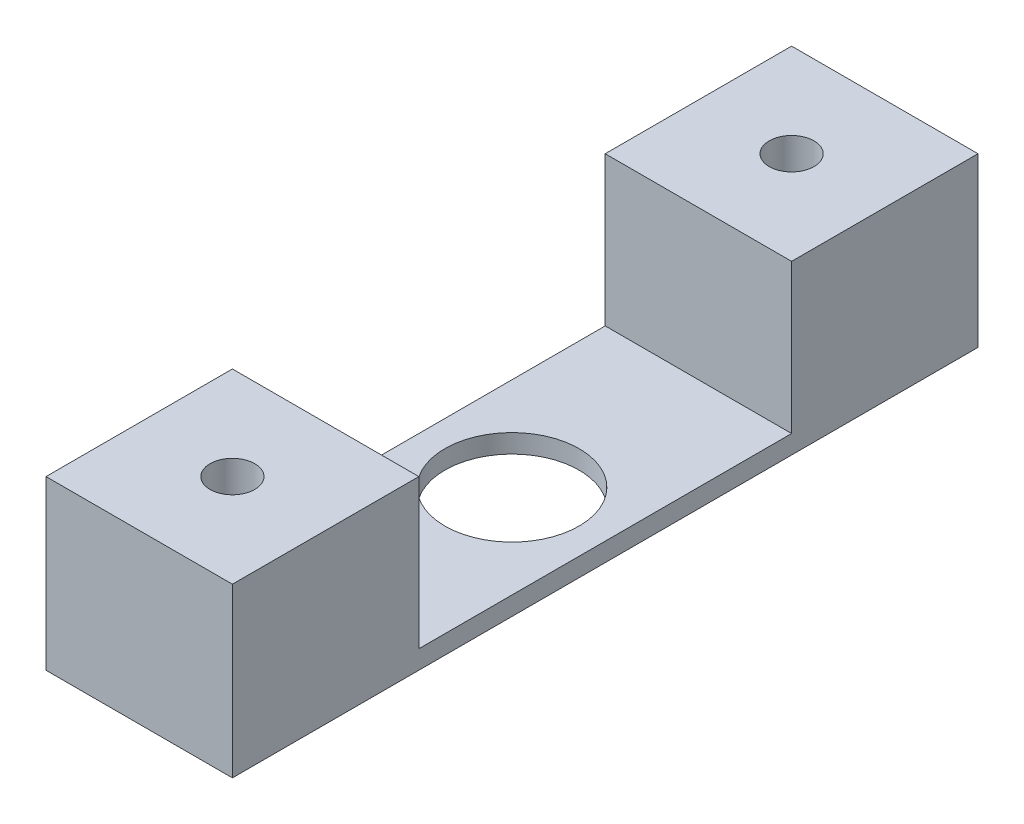
ISO-10303-21;
HEADER;
FILE_DESCRIPTION(('STEP AP214'),'2;1');
FILE_NAME('part.step','',(''),(''),'','','');
FILE_SCHEMA(('AUTOMOTIVE_DESIGN { 1 0 10303 214 1 1 1 1 }'));
ENDSEC;
DATA;
#1=APPLICATION_CONTEXT('core data for automotive mechanical design processes');
#2=APPLICATION_PROTOCOL_DEFINITION('international standard','automotive_design',2000,#1);
#3=PRODUCT_CONTEXT('',#1,'mechanical');
#4=PRODUCT('Part','Part','',(#3));
#5=PRODUCT_RELATED_PRODUCT_CATEGORY('part','',(#4));
#6=PRODUCT_DEFINITION_FORMATION('','',#4);
#7=PRODUCT_DEFINITION_CONTEXT('part definition',#1,'design');
#8=PRODUCT_DEFINITION('design','',#6,#7);
#9=PRODUCT_DEFINITION_SHAPE('','',#8);
#10=(LENGTH_UNIT() NAMED_UNIT(*) SI_UNIT(.MILLI.,.METRE.));
#11=(NAMED_UNIT(*) PLANE_ANGLE_UNIT() SI_UNIT($,.RADIAN.));
#12=(NAMED_UNIT(*) SI_UNIT($,.STERADIAN.) SOLID_ANGLE_UNIT());
#13=UNCERTAINTY_MEASURE_WITH_UNIT(LENGTH_MEASURE(1.E-05),#10,'distance_accuracy_value','');
#14=(GEOMETRIC_REPRESENTATION_CONTEXT(3) GLOBAL_UNCERTAINTY_ASSIGNED_CONTEXT((#13)) GLOBAL_UNIT_ASSIGNED_CONTEXT((#10,
#11,#12)) REPRESENTATION_CONTEXT('',''));
#15=CARTESIAN_POINT('',(0.,0.,0.));
#16=DIRECTION('',(0.,0.,1.));
#17=DIRECTION('',(1.,0.,0.));
#18=AXIS2_PLACEMENT_3D('',#15,#16,#17);
#19=CARTESIAN_POINT('',(0.,9.,0.));
#20=DIRECTION('',(0.,1.,0.));
#21=DIRECTION('',(0.,0.,1.));
#22=AXIS2_PLACEMENT_3D('',#19,#20,#21);
#23=PLANE('',#22);
#24=CARTESIAN_POINT('',(0.,9.,15.));
#25=DIRECTION('',(0.,1.,0.));
#26=DIRECTION('',(0.,0.,1.));
#27=AXIS2_PLACEMENT_3D('',#24,#25,#26);
#28=CIRCLE('',#27,1.19999999999999);
#29=CARTESIAN_POINT('',(0.,9.,16.2));
#30=VERTEX_POINT('',#29);
#31=EDGE_CURVE('E131',#30,#30,#28,.T.);
#32=ORIENTED_EDGE('',*,*,#31,.F.);
#33=EDGE_LOOP('',(#32));
#34=FACE_BOUND('',#33,.T.);
#35=DIRECTION('',(1.,0.,0.));
#36=VECTOR('',#35,1.);
#37=CARTESIAN_POINT('',(-5.,9.,10.));
#38=LINE('',#37,#36);
#39=CARTESIAN_POINT('',(-5.,9.,10.));
#40=VERTEX_POINT('',#39);
#41=CARTESIAN_POINT('',(5.,9.,10.));
#42=VERTEX_POINT('',#41);
#43=EDGE_CURVE('E152',#40,#42,#38,.T.);
#44=ORIENTED_EDGE('',*,*,#43,.F.);
#45=DIRECTION('',(0.,0.,1.));
#46=VECTOR('',#45,1.);
#47=CARTESIAN_POINT('',(-5.,9.,-20.));
#48=LINE('',#47,#46);
#49=CARTESIAN_POINT('',(-5.,9.,20.));
#50=VERTEX_POINT('',#49);
#51=EDGE_CURVE('E187',#40,#50,#48,.T.);
#52=ORIENTED_EDGE('',*,*,#51,.T.);
#53=DIRECTION('',(1.,0.,0.));
#54=VECTOR('',#53,1.);
#55=CARTESIAN_POINT('',(-5.,9.,20.));
#56=LINE('',#55,#54);
#57=CARTESIAN_POINT('',(5.,9.,20.));
#58=VERTEX_POINT('',#57);
#59=EDGE_CURVE('E64',#50,#58,#56,.T.);
#60=ORIENTED_EDGE('',*,*,#59,.T.);
#61=DIRECTION('',(0.,0.,-1.));
#62=VECTOR('',#61,1.);
#63=CARTESIAN_POINT('',(5.,9.,-20.));
#64=LINE('',#63,#62);
#65=EDGE_CURVE('E181',#58,#42,#64,.T.);
#66=ORIENTED_EDGE('',*,*,#65,.T.);
#67=EDGE_LOOP('',(#44,#52,#60,#66));
#68=FACE_BOUND('',#67,.T.);
#69=ADVANCED_FACE('F39',(#34,#68),#23,.T.);
#70=CARTESIAN_POINT('',(5.,9.,-20.));
#71=DIRECTION('',(-1.,0.,0.));
#72=DIRECTION('',(0.,0.,1.));
#73=AXIS2_PLACEMENT_3D('',#70,#71,#72);
#74=PLANE('',#73);
#75=DIRECTION('',(0.,0.,-1.));
#76=VECTOR('',#75,1.);
#77=CARTESIAN_POINT('',(5.,0.999999999999999,-10.));
#78=LINE('',#77,#76);
#79=CARTESIAN_POINT('',(5.,0.999999999999999,10.));
#80=VERTEX_POINT('',#79);
#81=CARTESIAN_POINT('',(5.,0.999999999999999,-10.));
#82=VERTEX_POINT('',#81);
#83=EDGE_CURVE('E147',#80,#82,#78,.T.);
#84=ORIENTED_EDGE('',*,*,#83,.F.);
#85=DIRECTION('',(0.,1.,0.));
#86=VECTOR('',#85,1.);
#87=CARTESIAN_POINT('',(5.,0.999999999999999,10.));
#88=LINE('',#87,#86);
#89=EDGE_CURVE('E167',#80,#42,#88,.T.);
#90=ORIENTED_EDGE('',*,*,#89,.T.);
#91=ORIENTED_EDGE('',*,*,#65,.F.);
#92=DIRECTION('',(0.,-1.,0.));
#93=VECTOR('',#92,1.);
#94=CARTESIAN_POINT('',(5.,9.,20.));
#95=LINE('',#94,#93);
#96=CARTESIAN_POINT('',(5.,0.,20.));
#97=VERTEX_POINT('',#96);
#98=EDGE_CURVE('E194',#58,#97,#95,.T.);
#99=ORIENTED_EDGE('',*,*,#98,.T.);
#100=DIRECTION('',(0.,0.,-1.));
#101=VECTOR('',#100,1.);
#102=CARTESIAN_POINT('',(5.,0.,-20.));
#103=LINE('',#102,#101);
#104=CARTESIAN_POINT('',(5.,0.,-20.));
#105=VERTEX_POINT('',#104);
#106=EDGE_CURVE('E171',#97,#105,#103,.T.);
#107=ORIENTED_EDGE('',*,*,#106,.T.);
#108=DIRECTION('',(0.,-1.,0.));
#109=VECTOR('',#108,1.);
#110=CARTESIAN_POINT('',(5.,9.,-20.));
#111=LINE('',#110,#109);
#112=CARTESIAN_POINT('',(5.,9.,-20.));
#113=VERTEX_POINT('',#112);
#114=EDGE_CURVE('E11',#113,#105,#111,.T.);
#115=ORIENTED_EDGE('',*,*,#114,.F.);
#116=CARTESIAN_POINT('',(5.,9.,-10.));
#117=VERTEX_POINT('',#116);
#118=EDGE_CURVE('E92',#117,#113,#64,.T.);
#119=ORIENTED_EDGE('',*,*,#118,.F.);
#120=DIRECTION('',(0.,1.,0.));
#121=VECTOR('',#120,1.);
#122=CARTESIAN_POINT('',(5.,0.999999999999999,-10.));
#123=LINE('',#122,#121);
#124=EDGE_CURVE('E55',#82,#117,#123,.T.);
#125=ORIENTED_EDGE('',*,*,#124,.F.);
#126=EDGE_LOOP('',(#84,#90,#91,#99,#107,#115,#119,#125));
#127=FACE_BOUND('',#126,.T.);
#128=ADVANCED_FACE('F41',(#127),#74,.F.);
#129=CARTESIAN_POINT('',(-5.,9.,-20.));
#130=DIRECTION('',(0.,0.,1.));
#131=DIRECTION('',(1.,0.,0.));
#132=AXIS2_PLACEMENT_3D('',#129,#130,#131);
#133=PLANE('',#132);
#134=DIRECTION('',(-1.,0.,0.));
#135=VECTOR('',#134,1.);
#136=CARTESIAN_POINT('',(-5.,0.,-20.));
#137=LINE('',#136,#135);
#138=CARTESIAN_POINT('',(-5.,0.,-20.));
#139=VERTEX_POINT('',#138);
#140=EDGE_CURVE('E198',#105,#139,#137,.T.);
#141=ORIENTED_EDGE('',*,*,#140,.T.);
#142=DIRECTION('',(0.,-1.,0.));
#143=VECTOR('',#142,1.);
#144=CARTESIAN_POINT('',(-5.,9.,-20.));
#145=LINE('',#144,#143);
#146=CARTESIAN_POINT('',(-5.,9.,-20.));
#147=VERTEX_POINT('',#146);
#148=EDGE_CURVE('E48',#147,#139,#145,.T.);
#149=ORIENTED_EDGE('',*,*,#148,.F.);
#150=DIRECTION('',(-1.,0.,0.));
#151=VECTOR('',#150,1.);
#152=CARTESIAN_POINT('',(-5.,9.,-20.));
#153=LINE('',#152,#151);
#154=EDGE_CURVE('E184',#113,#147,#153,.T.);
#155=ORIENTED_EDGE('',*,*,#154,.F.);
#156=ORIENTED_EDGE('',*,*,#114,.T.);
#157=EDGE_LOOP('',(#141,#149,#155,#156));
#158=FACE_BOUND('',#157,.T.);
#159=ADVANCED_FACE('F239',(#158),#133,.F.);
#160=CARTESIAN_POINT('',(-5.,9.,-20.));
#161=DIRECTION('',(1.,0.,0.));
#162=DIRECTION('',(0.,0.,-1.));
#163=AXIS2_PLACEMENT_3D('',#160,#161,#162);
#164=PLANE('',#163);
#165=ORIENTED_EDGE('',*,*,#51,.F.);
#166=DIRECTION('',(0.,1.,0.));
#167=VECTOR('',#166,1.);
#168=CARTESIAN_POINT('',(-5.,0.999999999999999,10.));
#169=LINE('',#168,#167);
#170=CARTESIAN_POINT('',(-5.,0.999999999999999,10.));
#171=VERTEX_POINT('',#170);
#172=EDGE_CURVE('E172',#171,#40,#169,.T.);
#173=ORIENTED_EDGE('',*,*,#172,.F.);
#174=DIRECTION('',(0.,0.,1.));
#175=VECTOR('',#174,1.);
#176=CARTESIAN_POINT('',(-5.,0.999999999999999,-10.));
#177=LINE('',#176,#175);
#178=CARTESIAN_POINT('',(-5.,0.999999999999999,-10.));
#179=VERTEX_POINT('',#178);
#180=EDGE_CURVE('E156',#179,#171,#177,.T.);
#181=ORIENTED_EDGE('',*,*,#180,.F.);
#182=DIRECTION('',(0.,1.,0.));
#183=VECTOR('',#182,1.);
#184=CARTESIAN_POINT('',(-5.,0.999999999999999,-10.));
#185=LINE('',#184,#183);
#186=CARTESIAN_POINT('',(-5.,9.,-10.));
#187=VERTEX_POINT('',#186);
#188=EDGE_CURVE('E175',#179,#187,#185,.T.);
#189=ORIENTED_EDGE('',*,*,#188,.T.);
#190=EDGE_CURVE('E188',#147,#187,#48,.T.);
#191=ORIENTED_EDGE('',*,*,#190,.F.);
#192=ORIENTED_EDGE('',*,*,#148,.T.);
#193=DIRECTION('',(0.,0.,1.));
#194=VECTOR('',#193,1.);
#195=CARTESIAN_POINT('',(-5.,0.,-20.));
#196=LINE('',#195,#194);
#197=CARTESIAN_POINT('',(-5.,0.,20.));
#198=VERTEX_POINT('',#197);
#199=EDGE_CURVE('E201',#139,#198,#196,.T.);
#200=ORIENTED_EDGE('',*,*,#199,.T.);
#201=DIRECTION('',(0.,-1.,0.));
#202=VECTOR('',#201,1.);
#203=CARTESIAN_POINT('',(-5.,9.,20.));
#204=LINE('',#203,#202);
#205=EDGE_CURVE('E208',#50,#198,#204,.T.);
#206=ORIENTED_EDGE('',*,*,#205,.F.);
#207=EDGE_LOOP('',(#165,#173,#181,#189,#191,#192,#200,#206));
#208=FACE_BOUND('',#207,.T.);
#209=ADVANCED_FACE('F217',(#208),#164,.F.);
#210=CARTESIAN_POINT('',(-5.,9.,20.));
#211=DIRECTION('',(0.,0.,-1.));
#212=DIRECTION('',(-1.,0.,0.));
#213=AXIS2_PLACEMENT_3D('',#210,#211,#212);
#214=PLANE('',#213);
#215=DIRECTION('',(1.,0.,0.));
#216=VECTOR('',#215,1.);
#217=CARTESIAN_POINT('',(-5.,0.,20.));
#218=LINE('',#217,#216);
#219=EDGE_CURVE('E85',#198,#97,#218,.T.);
#220=ORIENTED_EDGE('',*,*,#219,.T.);
#221=ORIENTED_EDGE('',*,*,#98,.F.);
#222=ORIENTED_EDGE('',*,*,#59,.F.);
#223=ORIENTED_EDGE('',*,*,#205,.T.);
#224=EDGE_LOOP('',(#220,#221,#222,#223));
#225=FACE_BOUND('',#224,.T.);
#226=ADVANCED_FACE('F227',(#225),#214,.F.);
#227=CARTESIAN_POINT('',(0.,9.,-15.));
#228=DIRECTION('',(0.,1.,0.));
#229=DIRECTION('',(0.,0.,1.));
#230=AXIS2_PLACEMENT_3D('',#227,#228,#229);
#231=CIRCLE('',#230,1.19999999999999);
#232=CARTESIAN_POINT('',(0.,9.,-13.8));
#233=VERTEX_POINT('',#232);
#234=EDGE_CURVE('E130',#233,#233,#231,.T.);
#235=ORIENTED_EDGE('',*,*,#234,.F.);
#236=EDGE_LOOP('',(#235));
#237=FACE_BOUND('',#236,.T.);
#238=DIRECTION('',(-1.,0.,0.));
#239=VECTOR('',#238,1.);
#240=CARTESIAN_POINT('',(-5.,9.,-10.));
#241=LINE('',#240,#239);
#242=EDGE_CURVE('E146',#117,#187,#241,.T.);
#243=ORIENTED_EDGE('',*,*,#242,.F.);
#244=ORIENTED_EDGE('',*,*,#118,.T.);
#245=ORIENTED_EDGE('',*,*,#154,.T.);
#246=ORIENTED_EDGE('',*,*,#190,.T.);
#247=EDGE_LOOP('',(#243,#244,#245,#246));
#248=FACE_BOUND('',#247,.T.);
#249=ADVANCED_FACE('F238',(#237,#248),#23,.T.);
#250=CARTESIAN_POINT('',(0.,0.,0.));
#251=DIRECTION('',(0.,1.,0.));
#252=DIRECTION('',(0.,0.,1.));
#253=AXIS2_PLACEMENT_3D('',#250,#251,#252);
#254=PLANE('',#253);
#255=CARTESIAN_POINT('',(0.,0.,0.));
#256=DIRECTION('',(0.,1.,0.));
#257=DIRECTION('',(0.,0.,1.));
#258=AXIS2_PLACEMENT_3D('',#255,#256,#257);
#259=CIRCLE('',#258,3.6);
#260=CARTESIAN_POINT('',(0.,0.,3.6));
#261=VERTEX_POINT('',#260);
#262=EDGE_CURVE('E139',#261,#261,#259,.T.);
#263=ORIENTED_EDGE('',*,*,#262,.T.);
#264=EDGE_LOOP('',(#263));
#265=FACE_BOUND('',#264,.T.);
#266=ORIENTED_EDGE('',*,*,#106,.F.);
#267=ORIENTED_EDGE('',*,*,#219,.F.);
#268=ORIENTED_EDGE('',*,*,#199,.F.);
#269=ORIENTED_EDGE('',*,*,#140,.F.);
#270=EDGE_LOOP('',(#266,#267,#268,#269));
#271=FACE_BOUND('',#270,.T.);
#272=ADVANCED_FACE('F222',(#265,#271),#254,.F.);
#273=CARTESIAN_POINT('',(-5.,0.999999999999999,10.));
#274=DIRECTION('',(0.,0.,1.));
#275=DIRECTION('',(1.,0.,0.));
#276=AXIS2_PLACEMENT_3D('',#273,#274,#275);
#277=PLANE('',#276);
#278=ORIENTED_EDGE('',*,*,#43,.T.);
#279=ORIENTED_EDGE('',*,*,#89,.F.);
#280=DIRECTION('',(1.,0.,0.));
#281=VECTOR('',#280,1.);
#282=CARTESIAN_POINT('',(-5.,0.999999999999999,10.));
#283=LINE('',#282,#281);
#284=EDGE_CURVE('E159',#171,#80,#283,.T.);
#285=ORIENTED_EDGE('',*,*,#284,.F.);
#286=ORIENTED_EDGE('',*,*,#172,.T.);
#287=EDGE_LOOP('',(#278,#279,#285,#286));
#288=FACE_BOUND('',#287,.T.);
#289=ADVANCED_FACE('F234',(#288),#277,.F.);
#290=CARTESIAN_POINT('',(-5.,0.999999999999999,-10.));
#291=DIRECTION('',(0.,0.,-1.));
#292=DIRECTION('',(-1.,0.,0.));
#293=AXIS2_PLACEMENT_3D('',#290,#291,#292);
#294=PLANE('',#293);
#295=ORIENTED_EDGE('',*,*,#242,.T.);
#296=ORIENTED_EDGE('',*,*,#188,.F.);
#297=DIRECTION('',(-1.,0.,0.));
#298=VECTOR('',#297,1.);
#299=CARTESIAN_POINT('',(-5.,0.999999999999999,-10.));
#300=LINE('',#299,#298);
#301=EDGE_CURVE('E151',#82,#179,#300,.T.);
#302=ORIENTED_EDGE('',*,*,#301,.F.);
#303=ORIENTED_EDGE('',*,*,#124,.T.);
#304=EDGE_LOOP('',(#295,#296,#302,#303));
#305=FACE_BOUND('',#304,.T.);
#306=ADVANCED_FACE('F278',(#305),#294,.F.);
#307=CARTESIAN_POINT('',(0.,0.999999999999999,0.));
#308=DIRECTION('',(0.,1.,0.));
#309=DIRECTION('',(0.,0.,1.));
#310=AXIS2_PLACEMENT_3D('',#307,#308,#309);
#311=PLANE('',#310);
#312=CARTESIAN_POINT('',(0.,0.999999999999999,0.));
#313=DIRECTION('',(0.,1.,0.));
#314=DIRECTION('',(0.,0.,1.));
#315=AXIS2_PLACEMENT_3D('',#312,#313,#314);
#316=CIRCLE('',#315,3.6);
#317=CARTESIAN_POINT('',(0.,0.999999999999999,3.6));
#318=VERTEX_POINT('',#317);
#319=EDGE_CURVE('E374',#318,#318,#316,.T.);
#320=ORIENTED_EDGE('',*,*,#319,.F.);
#321=EDGE_LOOP('',(#320));
#322=FACE_BOUND('',#321,.T.);
#323=ORIENTED_EDGE('',*,*,#83,.T.);
#324=ORIENTED_EDGE('',*,*,#301,.T.);
#325=ORIENTED_EDGE('',*,*,#180,.T.);
#326=ORIENTED_EDGE('',*,*,#284,.T.);
#327=EDGE_LOOP('',(#323,#324,#325,#326));
#328=FACE_BOUND('',#327,.T.);
#329=ADVANCED_FACE('F237',(#322,#328),#311,.T.);
#330=CARTESIAN_POINT('',(0.,2.99999999999999,-15.));
#331=DIRECTION('',(0.,1.,0.));
#332=DIRECTION('',(0.,0.,1.));
#333=AXIS2_PLACEMENT_3D('',#330,#331,#332);
#334=CONICAL_SURFACE('',#333,1.19999999999999,1.02974425867665);
#335=CARTESIAN_POINT('',(0.,2.27896725716692,-15.));
#336=VERTEX_POINT('',#335);
#337=VERTEX_LOOP('',#336);
#338=FACE_BOUND('',#337,.T.);
#339=CARTESIAN_POINT('',(0.,2.99999999999999,-15.));
#340=DIRECTION('',(0.,1.,0.));
#341=DIRECTION('',(0.,0.,1.));
#342=AXIS2_PLACEMENT_3D('',#339,#340,#341);
#343=CIRCLE('',#342,1.19999999999999);
#344=CARTESIAN_POINT('',(0.,2.99999999999999,-13.8));
#345=VERTEX_POINT('',#344);
#346=EDGE_CURVE('E136',#345,#345,#343,.T.);
#347=ORIENTED_EDGE('',*,*,#346,.T.);
#348=EDGE_LOOP('',(#347));
#349=FACE_BOUND('',#348,.T.);
#350=ADVANCED_FACE('F265',(#338,#349),#334,.F.);
#351=CARTESIAN_POINT('',(0.,9.,-15.));
#352=DIRECTION('',(0.,1.,0.));
#353=DIRECTION('',(0.,0.,1.));
#354=AXIS2_PLACEMENT_3D('',#351,#352,#353);
#355=CYLINDRICAL_SURFACE('',#354,1.19999999999999);
#356=ORIENTED_EDGE('',*,*,#346,.F.);
#357=EDGE_LOOP('',(#356));
#358=FACE_BOUND('',#357,.T.);
#359=ORIENTED_EDGE('',*,*,#234,.T.);
#360=EDGE_LOOP('',(#359));
#361=FACE_BOUND('',#360,.T.);
#362=ADVANCED_FACE('F123',(#358,#361),#355,.F.);
#363=CARTESIAN_POINT('',(0.,2.99999999999999,15.));
#364=DIRECTION('',(0.,1.,0.));
#365=DIRECTION('',(0.,0.,1.));
#366=AXIS2_PLACEMENT_3D('',#363,#364,#365);
#367=CONICAL_SURFACE('',#366,1.19999999999999,1.02974425867665);
#368=CARTESIAN_POINT('',(0.,2.27896725716692,15.));
#369=VERTEX_POINT('',#368);
#370=VERTEX_LOOP('',#369);
#371=FACE_BOUND('',#370,.T.);
#372=CARTESIAN_POINT('',(0.,2.99999999999999,15.));
#373=DIRECTION('',(0.,1.,0.));
#374=DIRECTION('',(0.,0.,1.));
#375=AXIS2_PLACEMENT_3D('',#372,#373,#374);
#376=CIRCLE('',#375,1.19999999999999);
#377=CARTESIAN_POINT('',(0.,2.99999999999999,16.2));
#378=VERTEX_POINT('',#377);
#379=EDGE_CURVE('E127',#378,#378,#376,.T.);
#380=ORIENTED_EDGE('',*,*,#379,.T.);
#381=EDGE_LOOP('',(#380));
#382=FACE_BOUND('',#381,.T.);
#383=ADVANCED_FACE('F119',(#371,#382),#367,.F.);
#384=CARTESIAN_POINT('',(0.,9.,15.));
#385=DIRECTION('',(0.,1.,0.));
#386=DIRECTION('',(0.,0.,1.));
#387=AXIS2_PLACEMENT_3D('',#384,#385,#386);
#388=CYLINDRICAL_SURFACE('',#387,1.19999999999999);
#389=ORIENTED_EDGE('',*,*,#379,.F.);
#390=EDGE_LOOP('',(#389));
#391=FACE_BOUND('',#390,.T.);
#392=ORIENTED_EDGE('',*,*,#31,.T.);
#393=EDGE_LOOP('',(#392));
#394=FACE_BOUND('',#393,.T.);
#395=ADVANCED_FACE('F122',(#391,#394),#388,.F.);
#396=CARTESIAN_POINT('',(0.,0.999999999999999,0.));
#397=DIRECTION('',(0.,1.,0.));
#398=DIRECTION('',(0.,0.,1.));
#399=AXIS2_PLACEMENT_3D('',#396,#397,#398);
#400=CYLINDRICAL_SURFACE('',#399,3.6);
#401=ORIENTED_EDGE('',*,*,#262,.F.);
#402=EDGE_LOOP('',(#401));
#403=FACE_BOUND('',#402,.T.);
#404=ORIENTED_EDGE('',*,*,#319,.T.);
#405=EDGE_LOOP('',(#404));
#406=FACE_BOUND('',#405,.T.);
#407=ADVANCED_FACE('F316',(#403,#406),#400,.F.);
#408=CLOSED_SHELL('',(#69,#128,#159,#209,#226,#249,#272,#289,#306,#329,#350,#362,#383,#395,#407));
#409=MANIFOLD_SOLID_BREP('B2',#408);
#410=ADVANCED_BREP_SHAPE_REPRESENTATION('',(#18,#409),#14);
#411=SHAPE_DEFINITION_REPRESENTATION(#9,#410);
ENDSEC;
END-ISO-10303-21;
